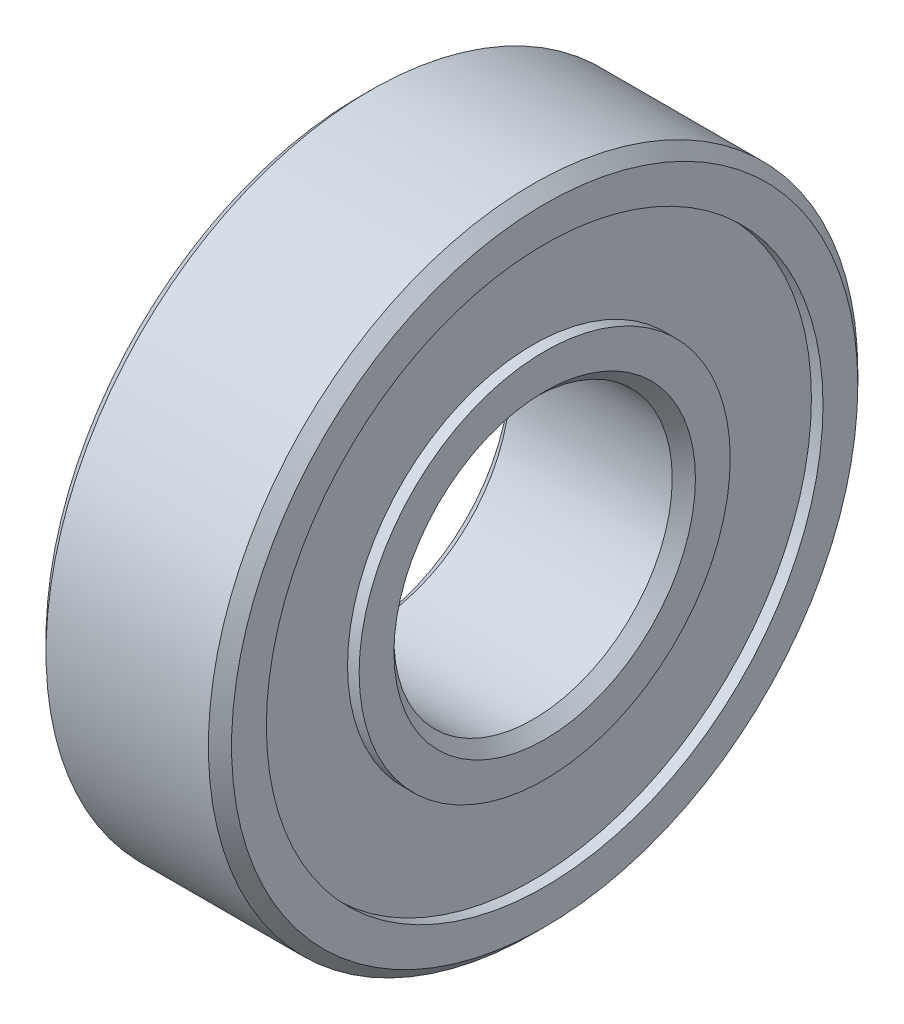
ISO-10303-21;
HEADER;
FILE_DESCRIPTION(('STEP AP214'),'2;1');
FILE_NAME('part.step','',(''),(''),'','','');
FILE_SCHEMA(('AUTOMOTIVE_DESIGN { 1 0 10303 214 1 1 1 1 }'));
ENDSEC;
DATA;
#1=APPLICATION_CONTEXT('core data for automotive mechanical design processes');
#2=APPLICATION_PROTOCOL_DEFINITION('international standard','automotive_design',2000,#1);
#3=PRODUCT_CONTEXT('',#1,'mechanical');
#4=PRODUCT('Part','Part','',(#3));
#5=PRODUCT_RELATED_PRODUCT_CATEGORY('part','',(#4));
#6=PRODUCT_DEFINITION_FORMATION('','',#4);
#7=PRODUCT_DEFINITION_CONTEXT('part definition',#1,'design');
#8=PRODUCT_DEFINITION('design','',#6,#7);
#9=PRODUCT_DEFINITION_SHAPE('','',#8);
#10=(LENGTH_UNIT() NAMED_UNIT(*) SI_UNIT(.MILLI.,.METRE.));
#11=(NAMED_UNIT(*) PLANE_ANGLE_UNIT() SI_UNIT($,.RADIAN.));
#12=(NAMED_UNIT(*) SI_UNIT($,.STERADIAN.) SOLID_ANGLE_UNIT());
#13=UNCERTAINTY_MEASURE_WITH_UNIT(LENGTH_MEASURE(1.E-05),#10,'distance_accuracy_value','');
#14=(GEOMETRIC_REPRESENTATION_CONTEXT(3) GLOBAL_UNCERTAINTY_ASSIGNED_CONTEXT((#13)) GLOBAL_UNIT_ASSIGNED_CONTEXT((#10,
#11,#12)) REPRESENTATION_CONTEXT('',''));
#15=CARTESIAN_POINT('',(0.,0.,0.));
#16=DIRECTION('',(0.,0.,1.));
#17=DIRECTION('',(1.,0.,0.));
#18=AXIS2_PLACEMENT_3D('',#15,#16,#17);
#19=CARTESIAN_POINT('',(3.5,0.,0.));
#20=DIRECTION('',(-1.,0.,0.));
#21=DIRECTION('',(0.,0.,1.));
#22=AXIS2_PLACEMENT_3D('',#19,#20,#21);
#23=CYLINDRICAL_SURFACE('',#22,12.);
#24=CARTESIAN_POINT('',(3.5,0.,0.));
#25=DIRECTION('',(-1.,0.,0.));
#26=DIRECTION('',(0.,0.,1.));
#27=AXIS2_PLACEMENT_3D('',#24,#25,#26);
#28=CIRCLE('',#27,12.);
#29=CARTESIAN_POINT('',(3.5,0.,12.));
#30=VERTEX_POINT('',#29);
#31=EDGE_CURVE('E12',#30,#30,#28,.T.);
#32=ORIENTED_EDGE('',*,*,#31,.T.);
#33=EDGE_LOOP('',(#32));
#34=FACE_BOUND('',#33,.T.);
#35=CARTESIAN_POINT('',(-3.5,0.,0.));
#36=DIRECTION('',(-1.,0.,0.));
#37=DIRECTION('',(0.,0.,1.));
#38=AXIS2_PLACEMENT_3D('',#35,#36,#37);
#39=CIRCLE('',#38,12.);
#40=CARTESIAN_POINT('',(-3.5,0.,12.));
#41=VERTEX_POINT('',#40);
#42=EDGE_CURVE('E48',#41,#41,#39,.T.);
#43=ORIENTED_EDGE('',*,*,#42,.F.);
#44=EDGE_LOOP('',(#43));
#45=FACE_BOUND('',#44,.T.);
#46=ADVANCED_FACE('F45',(#34,#45),#23,.T.);
#47=CARTESIAN_POINT('',(3.5,0.,0.));
#48=DIRECTION('',(-1.,0.,0.));
#49=DIRECTION('',(0.,0.,1.));
#50=AXIS2_PLACEMENT_3D('',#47,#48,#49);
#51=PLANE('',#50);
#52=CARTESIAN_POINT('',(3.5,0.,0.));
#53=DIRECTION('',(-1.,0.,0.));
#54=DIRECTION('',(0.,0.,1.));
#55=AXIS2_PLACEMENT_3D('',#52,#53,#54);
#56=CIRCLE('',#55,8.);
#57=CARTESIAN_POINT('',(3.5,0.,8.));
#58=VERTEX_POINT('',#57);
#59=EDGE_CURVE('E55',#58,#58,#56,.T.);
#60=ORIENTED_EDGE('',*,*,#59,.T.);
#61=EDGE_LOOP('',(#60));
#62=FACE_BOUND('',#61,.T.);
#63=ORIENTED_EDGE('',*,*,#31,.F.);
#64=EDGE_LOOP('',(#63));
#65=FACE_BOUND('',#64,.T.);
#66=ADVANCED_FACE('F63',(#62,#65),#51,.F.);
#67=CARTESIAN_POINT('',(-3.5,0.,0.));
#68=DIRECTION('',(-1.,0.,0.));
#69=DIRECTION('',(0.,0.,1.));
#70=AXIS2_PLACEMENT_3D('',#67,#68,#69);
#71=PLANE('',#70);
#72=CARTESIAN_POINT('',(-3.5,0.,0.));
#73=DIRECTION('',(-1.,0.,0.));
#74=DIRECTION('',(0.,0.,1.));
#75=AXIS2_PLACEMENT_3D('',#72,#73,#74);
#76=CIRCLE('',#75,8.);
#77=CARTESIAN_POINT('',(-3.5,0.,8.));
#78=VERTEX_POINT('',#77);
#79=EDGE_CURVE('E57',#78,#78,#76,.T.);
#80=ORIENTED_EDGE('',*,*,#79,.F.);
#81=EDGE_LOOP('',(#80));
#82=FACE_BOUND('',#81,.T.);
#83=ORIENTED_EDGE('',*,*,#42,.T.);
#84=EDGE_LOOP('',(#83));
#85=FACE_BOUND('',#84,.T.);
#86=ADVANCED_FACE('F69',(#82,#85),#71,.T.);
#87=CARTESIAN_POINT('',(3.5,0.,0.));
#88=DIRECTION('',(-1.,0.,0.));
#89=DIRECTION('',(0.,0.,1.));
#90=AXIS2_PLACEMENT_3D('',#87,#88,#89);
#91=CYLINDRICAL_SURFACE('',#90,8.);
#92=ORIENTED_EDGE('',*,*,#59,.F.);
#93=EDGE_LOOP('',(#92));
#94=FACE_BOUND('',#93,.T.);
#95=ORIENTED_EDGE('',*,*,#79,.T.);
#96=EDGE_LOOP('',(#95));
#97=FACE_BOUND('',#96,.T.);
#98=ADVANCED_FACE('F66',(#94,#97),#91,.F.);
#99=CLOSED_SHELL('',(#46,#66,#86,#98));
#100=MANIFOLD_SOLID_BREP('B2',#99);
#101=CARTESIAN_POINT('',(4.,0.,0.));
#102=DIRECTION('',(-1.,0.,0.));
#103=DIRECTION('',(0.,0.,1.));
#104=AXIS2_PLACEMENT_3D('',#101,#102,#103);
#105=CYLINDRICAL_SURFACE('',#104,6.);
#106=CARTESIAN_POINT('',(3.5,0.,0.));
#107=DIRECTION('',(1.,0.,0.));
#108=DIRECTION('',(0.,0.,-1.));
#109=AXIS2_PLACEMENT_3D('',#106,#107,#108);
#110=CIRCLE('',#109,6.);
#111=CARTESIAN_POINT('',(3.5,0.,-6.));
#112=VERTEX_POINT('',#111);
#113=EDGE_CURVE('E124',#112,#112,#110,.T.);
#114=ORIENTED_EDGE('',*,*,#113,.T.);
#115=EDGE_LOOP('',(#114));
#116=FACE_BOUND('',#115,.T.);
#117=CARTESIAN_POINT('',(-3.5,0.,0.));
#118=DIRECTION('',(1.,0.,0.));
#119=DIRECTION('',(0.,0.,-1.));
#120=AXIS2_PLACEMENT_3D('',#117,#118,#119);
#121=CIRCLE('',#120,6.);
#122=CARTESIAN_POINT('',(-3.5,0.,-6.));
#123=VERTEX_POINT('',#122);
#124=EDGE_CURVE('E128',#123,#123,#121,.F.);
#125=ORIENTED_EDGE('',*,*,#124,.T.);
#126=EDGE_LOOP('',(#125));
#127=FACE_BOUND('',#126,.T.);
#128=ADVANCED_FACE('F113',(#116,#127),#105,.F.);
#129=CARTESIAN_POINT('',(4.,0.,0.));
#130=DIRECTION('',(-1.,0.,0.));
#131=DIRECTION('',(0.,0.,1.));
#132=AXIS2_PLACEMENT_3D('',#129,#130,#131);
#133=CYLINDRICAL_SURFACE('',#132,8.);
#134=CARTESIAN_POINT('',(4.,0.,0.));
#135=DIRECTION('',(1.,0.,0.));
#136=DIRECTION('',(0.,0.,-1.));
#137=AXIS2_PLACEMENT_3D('',#134,#135,#136);
#138=CIRCLE('',#137,8.);
#139=CARTESIAN_POINT('',(4.,0.,-8.));
#140=VERTEX_POINT('',#139);
#141=EDGE_CURVE('E133',#140,#140,#138,.T.);
#142=ORIENTED_EDGE('',*,*,#141,.F.);
#143=EDGE_LOOP('',(#142));
#144=FACE_BOUND('',#143,.T.);
#145=CARTESIAN_POINT('',(-4.,0.,0.));
#146=DIRECTION('',(1.,0.,0.));
#147=DIRECTION('',(0.,0.,-1.));
#148=AXIS2_PLACEMENT_3D('',#145,#146,#147);
#149=CIRCLE('',#148,8.);
#150=CARTESIAN_POINT('',(-4.,0.,-8.));
#151=VERTEX_POINT('',#150);
#152=EDGE_CURVE('E134',#151,#151,#149,.T.);
#153=ORIENTED_EDGE('',*,*,#152,.T.);
#154=EDGE_LOOP('',(#153));
#155=FACE_BOUND('',#154,.T.);
#156=ADVANCED_FACE('F142',(#144,#155),#133,.T.);
#157=CARTESIAN_POINT('',(4.,0.,0.));
#158=DIRECTION('',(1.,0.,0.));
#159=DIRECTION('',(0.,0.,-1.));
#160=AXIS2_PLACEMENT_3D('',#157,#158,#159);
#161=PLANE('',#160);
#162=CARTESIAN_POINT('',(4.,0.,0.));
#163=DIRECTION('',(1.,0.,0.));
#164=DIRECTION('',(0.,0.,-1.));
#165=AXIS2_PLACEMENT_3D('',#162,#163,#164);
#166=CIRCLE('',#165,6.5);
#167=CARTESIAN_POINT('',(4.,0.,-6.5));
#168=VERTEX_POINT('',#167);
#169=EDGE_CURVE('E120',#168,#168,#166,.F.);
#170=ORIENTED_EDGE('',*,*,#169,.T.);
#171=EDGE_LOOP('',(#170));
#172=FACE_BOUND('',#171,.T.);
#173=ORIENTED_EDGE('',*,*,#141,.T.);
#174=EDGE_LOOP('',(#173));
#175=FACE_BOUND('',#174,.T.);
#176=ADVANCED_FACE('F140',(#172,#175),#161,.T.);
#177=CARTESIAN_POINT('',(-4.,0.,0.));
#178=DIRECTION('',(1.,0.,0.));
#179=DIRECTION('',(0.,0.,-1.));
#180=AXIS2_PLACEMENT_3D('',#177,#178,#179);
#181=PLANE('',#180);
#182=CARTESIAN_POINT('',(-4.,0.,0.));
#183=DIRECTION('',(1.,0.,0.));
#184=DIRECTION('',(0.,0.,-1.));
#185=AXIS2_PLACEMENT_3D('',#182,#183,#184);
#186=CIRCLE('',#185,6.5);
#187=CARTESIAN_POINT('',(-4.,0.,-6.5));
#188=VERTEX_POINT('',#187);
#189=EDGE_CURVE('E44',#188,#188,#186,.T.);
#190=ORIENTED_EDGE('',*,*,#189,.T.);
#191=EDGE_LOOP('',(#190));
#192=FACE_BOUND('',#191,.T.);
#193=ORIENTED_EDGE('',*,*,#152,.F.);
#194=EDGE_LOOP('',(#193));
#195=FACE_BOUND('',#194,.T.);
#196=ADVANCED_FACE('F148',(#192,#195),#181,.F.);
#197=CARTESIAN_POINT('',(3.5,0.,0.));
#198=DIRECTION('',(1.,0.,0.));
#199=DIRECTION('',(0.,0.,-1.));
#200=AXIS2_PLACEMENT_3D('',#197,#198,#199);
#201=CONICAL_SURFACE('',#200,6.,0.785398163397448);
#202=ORIENTED_EDGE('',*,*,#169,.F.);
#203=EDGE_LOOP('',(#202));
#204=FACE_BOUND('',#203,.T.);
#205=ORIENTED_EDGE('',*,*,#113,.F.);
#206=EDGE_LOOP('',(#205));
#207=FACE_BOUND('',#206,.T.);
#208=ADVANCED_FACE('F150',(#204,#207),#201,.F.);
#209=CARTESIAN_POINT('',(-4.,0.,0.));
#210=DIRECTION('',(-1.,0.,0.));
#211=DIRECTION('',(0.,0.,1.));
#212=AXIS2_PLACEMENT_3D('',#209,#210,#211);
#213=CONICAL_SURFACE('',#212,6.5,0.785398163397447);
#214=ORIENTED_EDGE('',*,*,#124,.F.);
#215=EDGE_LOOP('',(#214));
#216=FACE_BOUND('',#215,.T.);
#217=ORIENTED_EDGE('',*,*,#189,.F.);
#218=EDGE_LOOP('',(#217));
#219=FACE_BOUND('',#218,.T.);
#220=ADVANCED_FACE('F115',(#216,#219),#213,.F.);
#221=CLOSED_SHELL('',(#128,#156,#176,#196,#208,#220));
#222=MANIFOLD_SOLID_BREP('B7',#221);
#223=CARTESIAN_POINT('',(4.,0.,0.));
#224=DIRECTION('',(-1.,0.,0.));
#225=DIRECTION('',(0.,0.,1.));
#226=AXIS2_PLACEMENT_3D('',#223,#224,#225);
#227=CYLINDRICAL_SURFACE('',#226,12.);
#228=CARTESIAN_POINT('',(4.,0.,0.));
#229=DIRECTION('',(1.,0.,0.));
#230=DIRECTION('',(0.,0.,-1.));
#231=AXIS2_PLACEMENT_3D('',#228,#229,#230);
#232=CIRCLE('',#231,12.);
#233=CARTESIAN_POINT('',(4.,0.,-12.));
#234=VERTEX_POINT('',#233);
#235=EDGE_CURVE('E224',#234,#234,#232,.T.);
#236=ORIENTED_EDGE('',*,*,#235,.T.);
#237=EDGE_LOOP('',(#236));
#238=FACE_BOUND('',#237,.T.);
#239=CARTESIAN_POINT('',(-4.,0.,0.));
#240=DIRECTION('',(1.,0.,0.));
#241=DIRECTION('',(0.,0.,-1.));
#242=AXIS2_PLACEMENT_3D('',#239,#240,#241);
#243=CIRCLE('',#242,12.);
#244=CARTESIAN_POINT('',(-4.,0.,-12.));
#245=VERTEX_POINT('',#244);
#246=EDGE_CURVE('E225',#245,#245,#243,.T.);
#247=ORIENTED_EDGE('',*,*,#246,.F.);
#248=EDGE_LOOP('',(#247));
#249=FACE_BOUND('',#248,.T.);
#250=ADVANCED_FACE('F204',(#238,#249),#227,.F.);
#251=CARTESIAN_POINT('',(4.,0.,0.));
#252=DIRECTION('',(-1.,0.,0.));
#253=DIRECTION('',(0.,0.,1.));
#254=AXIS2_PLACEMENT_3D('',#251,#252,#253);
#255=CYLINDRICAL_SURFACE('',#254,14.);
#256=CARTESIAN_POINT('',(3.5,0.,0.));
#257=DIRECTION('',(1.,0.,0.));
#258=DIRECTION('',(0.,0.,-1.));
#259=AXIS2_PLACEMENT_3D('',#256,#257,#258);
#260=CIRCLE('',#259,14.);
#261=CARTESIAN_POINT('',(3.5,0.,-14.));
#262=VERTEX_POINT('',#261);
#263=EDGE_CURVE('E211',#262,#262,#260,.F.);
#264=ORIENTED_EDGE('',*,*,#263,.T.);
#265=EDGE_LOOP('',(#264));
#266=FACE_BOUND('',#265,.T.);
#267=CARTESIAN_POINT('',(-3.5,0.,0.));
#268=DIRECTION('',(1.,0.,0.));
#269=DIRECTION('',(0.,0.,-1.));
#270=AXIS2_PLACEMENT_3D('',#267,#268,#269);
#271=CIRCLE('',#270,14.);
#272=CARTESIAN_POINT('',(-3.5,0.,-14.));
#273=VERTEX_POINT('',#272);
#274=EDGE_CURVE('E215',#273,#273,#271,.T.);
#275=ORIENTED_EDGE('',*,*,#274,.T.);
#276=EDGE_LOOP('',(#275));
#277=FACE_BOUND('',#276,.T.);
#278=ADVANCED_FACE('F236',(#266,#277),#255,.T.);
#279=CARTESIAN_POINT('',(4.,0.,0.));
#280=DIRECTION('',(1.,0.,0.));
#281=DIRECTION('',(0.,0.,-1.));
#282=AXIS2_PLACEMENT_3D('',#279,#280,#281);
#283=PLANE('',#282);
#284=CARTESIAN_POINT('',(4.,0.,0.));
#285=DIRECTION('',(1.,0.,0.));
#286=DIRECTION('',(0.,0.,-1.));
#287=AXIS2_PLACEMENT_3D('',#284,#285,#286);
#288=CIRCLE('',#287,13.5);
#289=CARTESIAN_POINT('',(4.,0.,-13.5));
#290=VERTEX_POINT('',#289);
#291=EDGE_CURVE('E219',#290,#290,#288,.T.);
#292=ORIENTED_EDGE('',*,*,#291,.T.);
#293=EDGE_LOOP('',(#292));
#294=FACE_BOUND('',#293,.T.);
#295=ORIENTED_EDGE('',*,*,#235,.F.);
#296=EDGE_LOOP('',(#295));
#297=FACE_BOUND('',#296,.T.);
#298=ADVANCED_FACE('F233',(#294,#297),#283,.T.);
#299=CARTESIAN_POINT('',(-4.,0.,0.));
#300=DIRECTION('',(1.,0.,0.));
#301=DIRECTION('',(0.,0.,-1.));
#302=AXIS2_PLACEMENT_3D('',#299,#300,#301);
#303=PLANE('',#302);
#304=CARTESIAN_POINT('',(-4.,0.,0.));
#305=DIRECTION('',(1.,0.,0.));
#306=DIRECTION('',(0.,0.,-1.));
#307=AXIS2_PLACEMENT_3D('',#304,#305,#306);
#308=CIRCLE('',#307,13.5);
#309=CARTESIAN_POINT('',(-4.,0.,-13.5));
#310=VERTEX_POINT('',#309);
#311=EDGE_CURVE('E112',#310,#310,#308,.F.);
#312=ORIENTED_EDGE('',*,*,#311,.T.);
#313=EDGE_LOOP('',(#312));
#314=FACE_BOUND('',#313,.T.);
#315=ORIENTED_EDGE('',*,*,#246,.T.);
#316=EDGE_LOOP('',(#315));
#317=FACE_BOUND('',#316,.T.);
#318=ADVANCED_FACE('F235',(#314,#317),#303,.F.);
#319=CARTESIAN_POINT('',(4.,0.,0.));
#320=DIRECTION('',(-1.,0.,0.));
#321=DIRECTION('',(0.,0.,1.));
#322=AXIS2_PLACEMENT_3D('',#319,#320,#321);
#323=CONICAL_SURFACE('',#322,13.5,0.78539816339745);
#324=ORIENTED_EDGE('',*,*,#263,.F.);
#325=EDGE_LOOP('',(#324));
#326=FACE_BOUND('',#325,.T.);
#327=ORIENTED_EDGE('',*,*,#291,.F.);
#328=EDGE_LOOP('',(#327));
#329=FACE_BOUND('',#328,.T.);
#330=ADVANCED_FACE('F243',(#326,#329),#323,.T.);
#331=CARTESIAN_POINT('',(-3.5,0.,0.));
#332=DIRECTION('',(1.,0.,0.));
#333=DIRECTION('',(0.,0.,-1.));
#334=AXIS2_PLACEMENT_3D('',#331,#332,#333);
#335=CONICAL_SURFACE('',#334,14.,0.785398163397447);
#336=ORIENTED_EDGE('',*,*,#311,.F.);
#337=EDGE_LOOP('',(#336));
#338=FACE_BOUND('',#337,.T.);
#339=ORIENTED_EDGE('',*,*,#274,.F.);
#340=EDGE_LOOP('',(#339));
#341=FACE_BOUND('',#340,.T.);
#342=ADVANCED_FACE('F206',(#338,#341),#335,.T.);
#343=CLOSED_SHELL('',(#250,#278,#298,#318,#330,#342));
#344=MANIFOLD_SOLID_BREP('B39',#343);
#345=ADVANCED_BREP_SHAPE_REPRESENTATION('',(#18,#100,#222,#344),#14);
#346=SHAPE_DEFINITION_REPRESENTATION(#9,#345);
ENDSEC;
END-ISO-10303-21;
